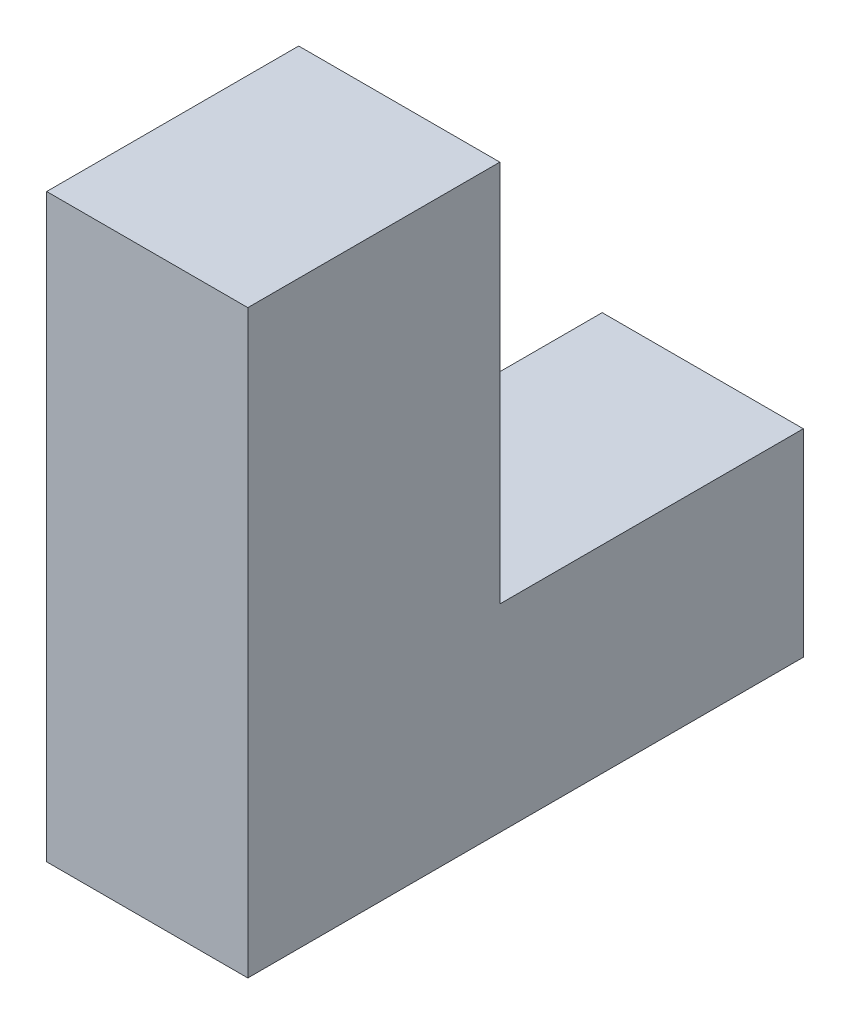
ISO-10303-21;
HEADER;
FILE_DESCRIPTION(('STEP AP214'),'2;1');
FILE_NAME('part.step','',(''),(''),'','','');
FILE_SCHEMA(('AUTOMOTIVE_DESIGN { 1 0 10303 214 1 1 1 1 }'));
ENDSEC;
DATA;
#1=APPLICATION_CONTEXT('core data for automotive mechanical design processes');
#2=APPLICATION_PROTOCOL_DEFINITION('international standard','automotive_design',2000,#1);
#3=PRODUCT_CONTEXT('',#1,'mechanical');
#4=PRODUCT('Part','Part','',(#3));
#5=PRODUCT_RELATED_PRODUCT_CATEGORY('part','',(#4));
#6=PRODUCT_DEFINITION_FORMATION('','',#4);
#7=PRODUCT_DEFINITION_CONTEXT('part definition',#1,'design');
#8=PRODUCT_DEFINITION('design','',#6,#7);
#9=PRODUCT_DEFINITION_SHAPE('','',#8);
#10=(LENGTH_UNIT() NAMED_UNIT(*) SI_UNIT(.MILLI.,.METRE.));
#11=(NAMED_UNIT(*) PLANE_ANGLE_UNIT() SI_UNIT($,.RADIAN.));
#12=(NAMED_UNIT(*) SI_UNIT($,.STERADIAN.) SOLID_ANGLE_UNIT());
#13=UNCERTAINTY_MEASURE_WITH_UNIT(LENGTH_MEASURE(1.E-05),#10,'distance_accuracy_value','');
#14=(GEOMETRIC_REPRESENTATION_CONTEXT(3) GLOBAL_UNCERTAINTY_ASSIGNED_CONTEXT((#13)) GLOBAL_UNIT_ASSIGNED_CONTEXT((#10,
#11,#12)) REPRESENTATION_CONTEXT('',''));
#15=CARTESIAN_POINT('',(0.,0.,0.));
#16=DIRECTION('',(0.,0.,1.));
#17=DIRECTION('',(1.,0.,0.));
#18=AXIS2_PLACEMENT_3D('',#15,#16,#17);
#19=CARTESIAN_POINT('',(10.,-14.6949858516856,-55.2374021746395));
#20=DIRECTION('',(0.,1.,0.));
#21=DIRECTION('',(0.,0.,1.));
#22=AXIS2_PLACEMENT_3D('',#19,#20,#21);
#23=PLANE('',#22);
#24=DIRECTION('',(0.,0.,-1.));
#25=VECTOR('',#24,1.);
#26=CARTESIAN_POINT('',(-10.,-14.6949858516856,-55.2374021746395));
#27=LINE('',#26,#25);
#28=CARTESIAN_POINT('',(-10.,-14.6949858516856,0.));
#29=VERTEX_POINT('',#28);
#30=CARTESIAN_POINT('',(-10.,-14.6949858516856,-55.2374021746395));
#31=VERTEX_POINT('',#30);
#32=EDGE_CURVE('E114',#29,#31,#27,.T.);
#33=ORIENTED_EDGE('',*,*,#32,.T.);
#34=DIRECTION('',(-1.,0.,0.));
#35=VECTOR('',#34,1.);
#36=CARTESIAN_POINT('',(10.,-14.6949858516856,-55.2374021746395));
#37=LINE('',#36,#35);
#38=CARTESIAN_POINT('',(10.,-14.6949858516856,-55.2374021746395));
#39=VERTEX_POINT('',#38);
#40=EDGE_CURVE('E11',#39,#31,#37,.T.);
#41=ORIENTED_EDGE('',*,*,#40,.F.);
#42=DIRECTION('',(0.,0.,-1.));
#43=VECTOR('',#42,1.);
#44=CARTESIAN_POINT('',(10.,-14.6949858516856,-55.2374021746395));
#45=LINE('',#44,#43);
#46=CARTESIAN_POINT('',(10.,-14.6949858516856,0.));
#47=VERTEX_POINT('',#46);
#48=EDGE_CURVE('E124',#47,#39,#45,.T.);
#49=ORIENTED_EDGE('',*,*,#48,.F.);
#50=DIRECTION('',(-1.,0.,0.));
#51=VECTOR('',#50,1.);
#52=CARTESIAN_POINT('',(10.,-14.6949858516856,0.));
#53=LINE('',#52,#51);
#54=EDGE_CURVE('E110',#47,#29,#53,.T.);
#55=ORIENTED_EDGE('',*,*,#54,.T.);
#56=EDGE_LOOP('',(#33,#41,#49,#55));
#57=FACE_BOUND('',#56,.T.);
#58=ADVANCED_FACE('F30',(#57),#23,.F.);
#59=CARTESIAN_POINT('',(10.,4.98579877110759,-55.2374021746395));
#60=DIRECTION('',(0.,0.,1.));
#61=DIRECTION('',(1.,0.,0.));
#62=AXIS2_PLACEMENT_3D('',#59,#60,#61);
#63=PLANE('',#62);
#64=DIRECTION('',(0.,1.,0.));
#65=VECTOR('',#64,1.);
#66=CARTESIAN_POINT('',(-10.,4.98579877110759,-55.2374021746395));
#67=LINE('',#66,#65);
#68=CARTESIAN_POINT('',(-10.,4.98579877110759,-55.2374021746395));
#69=VERTEX_POINT('',#68);
#70=EDGE_CURVE('E117',#31,#69,#67,.T.);
#71=ORIENTED_EDGE('',*,*,#70,.T.);
#72=DIRECTION('',(-1.,0.,0.));
#73=VECTOR('',#72,1.);
#74=CARTESIAN_POINT('',(10.,4.98579877110759,-55.2374021746395));
#75=LINE('',#74,#73);
#76=CARTESIAN_POINT('',(10.,4.98579877110759,-55.2374021746395));
#77=VERTEX_POINT('',#76);
#78=EDGE_CURVE('E38',#77,#69,#75,.T.);
#79=ORIENTED_EDGE('',*,*,#78,.F.);
#80=DIRECTION('',(0.,1.,0.));
#81=VECTOR('',#80,1.);
#82=CARTESIAN_POINT('',(10.,4.98579877110759,-55.2374021746395));
#83=LINE('',#82,#81);
#84=EDGE_CURVE('E83',#39,#77,#83,.T.);
#85=ORIENTED_EDGE('',*,*,#84,.F.);
#86=ORIENTED_EDGE('',*,*,#40,.T.);
#87=EDGE_LOOP('',(#71,#79,#85,#86));
#88=FACE_BOUND('',#87,.T.);
#89=ADVANCED_FACE('F148',(#88),#63,.F.);
#90=CARTESIAN_POINT('',(10.,4.98579877110759,-25.0601990863566));
#91=DIRECTION('',(0.,-1.,0.));
#92=DIRECTION('',(0.,0.,-1.));
#93=AXIS2_PLACEMENT_3D('',#90,#91,#92);
#94=PLANE('',#93);
#95=DIRECTION('',(0.,0.,1.));
#96=VECTOR('',#95,1.);
#97=CARTESIAN_POINT('',(-10.,4.98579877110759,-25.0601990863566));
#98=LINE('',#97,#96);
#99=CARTESIAN_POINT('',(-10.,4.98579877110759,-25.0601990863566));
#100=VERTEX_POINT('',#99);
#101=EDGE_CURVE('E119',#69,#100,#98,.T.);
#102=ORIENTED_EDGE('',*,*,#101,.T.);
#103=DIRECTION('',(-1.,0.,0.));
#104=VECTOR('',#103,1.);
#105=CARTESIAN_POINT('',(10.,4.98579877110759,-25.0601990863566));
#106=LINE('',#105,#104);
#107=CARTESIAN_POINT('',(10.,4.98579877110759,-25.0601990863566));
#108=VERTEX_POINT('',#107);
#109=EDGE_CURVE('E105',#108,#100,#106,.T.);
#110=ORIENTED_EDGE('',*,*,#109,.F.);
#111=DIRECTION('',(0.,0.,1.));
#112=VECTOR('',#111,1.);
#113=CARTESIAN_POINT('',(10.,4.98579877110759,-25.0601990863566));
#114=LINE('',#113,#112);
#115=EDGE_CURVE('E96',#77,#108,#114,.T.);
#116=ORIENTED_EDGE('',*,*,#115,.F.);
#117=ORIENTED_EDGE('',*,*,#78,.T.);
#118=EDGE_LOOP('',(#102,#110,#116,#117));
#119=FACE_BOUND('',#118,.T.);
#120=ADVANCED_FACE('F130',(#119),#94,.F.);
#121=CARTESIAN_POINT('',(10.,43.0353157085077,-25.0601990863566));
#122=DIRECTION('',(0.,0.,1.));
#123=DIRECTION('',(1.,0.,0.));
#124=AXIS2_PLACEMENT_3D('',#121,#122,#123);
#125=PLANE('',#124);
#126=DIRECTION('',(0.,1.,0.));
#127=VECTOR('',#126,1.);
#128=CARTESIAN_POINT('',(-10.,43.0353157085077,-25.0601990863566));
#129=LINE('',#128,#127);
#130=CARTESIAN_POINT('',(-10.,43.0353157085077,-25.0601990863566));
#131=VERTEX_POINT('',#130);
#132=EDGE_CURVE('E104',#100,#131,#129,.T.);
#133=ORIENTED_EDGE('',*,*,#132,.T.);
#134=DIRECTION('',(-1.,0.,0.));
#135=VECTOR('',#134,1.);
#136=CARTESIAN_POINT('',(10.,43.0353157085077,-25.0601990863566));
#137=LINE('',#136,#135);
#138=CARTESIAN_POINT('',(10.,43.0353157085077,-25.0601990863566));
#139=VERTEX_POINT('',#138);
#140=EDGE_CURVE('E101',#139,#131,#137,.T.);
#141=ORIENTED_EDGE('',*,*,#140,.F.);
#142=DIRECTION('',(0.,1.,0.));
#143=VECTOR('',#142,1.);
#144=CARTESIAN_POINT('',(10.,43.0353157085077,-25.0601990863566));
#145=LINE('',#144,#143);
#146=EDGE_CURVE('E90',#108,#139,#145,.T.);
#147=ORIENTED_EDGE('',*,*,#146,.F.);
#148=ORIENTED_EDGE('',*,*,#109,.T.);
#149=EDGE_LOOP('',(#133,#141,#147,#148));
#150=FACE_BOUND('',#149,.T.);
#151=ADVANCED_FACE('F102',(#150),#125,.F.);
#152=CARTESIAN_POINT('',(10.,43.0353157085077,0.));
#153=DIRECTION('',(0.,-1.,0.));
#154=DIRECTION('',(0.,0.,-1.));
#155=AXIS2_PLACEMENT_3D('',#152,#153,#154);
#156=PLANE('',#155);
#157=DIRECTION('',(0.,0.,1.));
#158=VECTOR('',#157,1.);
#159=CARTESIAN_POINT('',(-10.,43.0353157085077,0.));
#160=LINE('',#159,#158);
#161=CARTESIAN_POINT('',(-10.,43.0353157085077,0.));
#162=VERTEX_POINT('',#161);
#163=EDGE_CURVE('E69',#131,#162,#160,.T.);
#164=ORIENTED_EDGE('',*,*,#163,.T.);
#165=DIRECTION('',(-1.,0.,0.));
#166=VECTOR('',#165,1.);
#167=CARTESIAN_POINT('',(10.,43.0353157085077,0.));
#168=LINE('',#167,#166);
#169=CARTESIAN_POINT('',(10.,43.0353157085077,0.));
#170=VERTEX_POINT('',#169);
#171=EDGE_CURVE('E106',#170,#162,#168,.T.);
#172=ORIENTED_EDGE('',*,*,#171,.F.);
#173=DIRECTION('',(0.,0.,1.));
#174=VECTOR('',#173,1.);
#175=CARTESIAN_POINT('',(10.,43.0353157085077,0.));
#176=LINE('',#175,#174);
#177=EDGE_CURVE('E94',#139,#170,#176,.T.);
#178=ORIENTED_EDGE('',*,*,#177,.F.);
#179=ORIENTED_EDGE('',*,*,#140,.T.);
#180=EDGE_LOOP('',(#164,#172,#178,#179));
#181=FACE_BOUND('',#180,.T.);
#182=ADVANCED_FACE('F108',(#181),#156,.F.);
#183=CARTESIAN_POINT('',(10.,-14.6949858516856,0.));
#184=DIRECTION('',(0.,0.,-1.));
#185=DIRECTION('',(-1.,0.,0.));
#186=AXIS2_PLACEMENT_3D('',#183,#184,#185);
#187=PLANE('',#186);
#188=DIRECTION('',(0.,-1.,0.));
#189=VECTOR('',#188,1.);
#190=CARTESIAN_POINT('',(-10.,-14.6949858516856,0.));
#191=LINE('',#190,#189);
#192=EDGE_CURVE('E75',#162,#29,#191,.T.);
#193=ORIENTED_EDGE('',*,*,#192,.T.);
#194=ORIENTED_EDGE('',*,*,#54,.F.);
#195=DIRECTION('',(0.,-1.,0.));
#196=VECTOR('',#195,1.);
#197=CARTESIAN_POINT('',(10.,-14.6949858516856,0.));
#198=LINE('',#197,#196);
#199=EDGE_CURVE('E46',#170,#47,#198,.T.);
#200=ORIENTED_EDGE('',*,*,#199,.F.);
#201=ORIENTED_EDGE('',*,*,#171,.T.);
#202=EDGE_LOOP('',(#193,#194,#200,#201));
#203=FACE_BOUND('',#202,.T.);
#204=ADVANCED_FACE('F137',(#203),#187,.F.);
#205=CARTESIAN_POINT('',(10.,-14.6949858516856,0.));
#206=DIRECTION('',(-1.,0.,0.));
#207=DIRECTION('',(0.,0.,1.));
#208=AXIS2_PLACEMENT_3D('',#205,#206,#207);
#209=PLANE('',#208);
#210=ORIENTED_EDGE('',*,*,#48,.T.);
#211=ORIENTED_EDGE('',*,*,#84,.T.);
#212=ORIENTED_EDGE('',*,*,#115,.T.);
#213=ORIENTED_EDGE('',*,*,#146,.T.);
#214=ORIENTED_EDGE('',*,*,#177,.T.);
#215=ORIENTED_EDGE('',*,*,#199,.T.);
#216=EDGE_LOOP('',(#210,#211,#212,#213,#214,#215));
#217=FACE_BOUND('',#216,.T.);
#218=ADVANCED_FACE('F92',(#217),#209,.F.);
#219=CARTESIAN_POINT('',(-10.,-14.6949858516856,0.));
#220=DIRECTION('',(-1.,0.,0.));
#221=DIRECTION('',(0.,0.,1.));
#222=AXIS2_PLACEMENT_3D('',#219,#220,#221);
#223=PLANE('',#222);
#224=ORIENTED_EDGE('',*,*,#32,.F.);
#225=ORIENTED_EDGE('',*,*,#192,.F.);
#226=ORIENTED_EDGE('',*,*,#163,.F.);
#227=ORIENTED_EDGE('',*,*,#132,.F.);
#228=ORIENTED_EDGE('',*,*,#101,.F.);
#229=ORIENTED_EDGE('',*,*,#70,.F.);
#230=EDGE_LOOP('',(#224,#225,#226,#227,#228,#229));
#231=FACE_BOUND('',#230,.T.);
#232=ADVANCED_FACE('F133',(#231),#223,.T.);
#233=CLOSED_SHELL('',(#58,#89,#120,#151,#182,#204,#218,#232));
#234=MANIFOLD_SOLID_BREP('B2',#233);
#235=ADVANCED_BREP_SHAPE_REPRESENTATION('',(#18,#234),#14);
#236=SHAPE_DEFINITION_REPRESENTATION(#9,#235);
ENDSEC;
END-ISO-10303-21;
